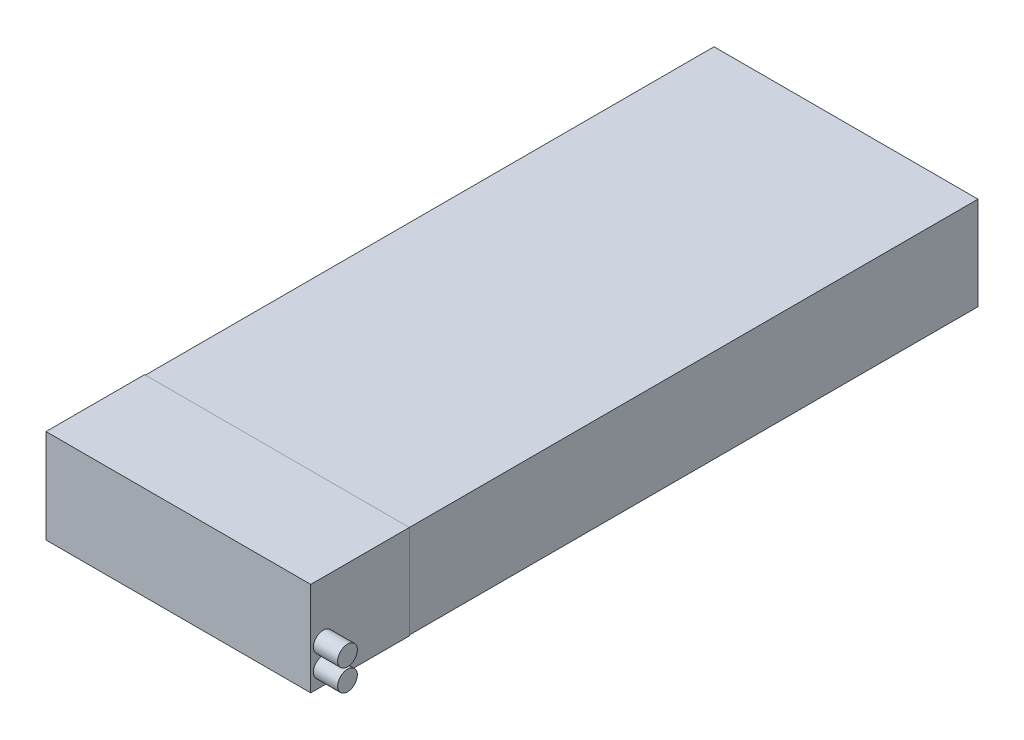
ISO-10303-21;
HEADER;
FILE_DESCRIPTION(('STEP AP214'),'2;1');
FILE_NAME('part.step','',(''),(''),'','','');
FILE_SCHEMA(('AUTOMOTIVE_DESIGN { 1 0 10303 214 1 1 1 1 }'));
ENDSEC;
DATA;
#1=APPLICATION_CONTEXT('core data for automotive mechanical design processes');
#2=APPLICATION_PROTOCOL_DEFINITION('international standard','automotive_design',2000,#1);
#3=PRODUCT_CONTEXT('',#1,'mechanical');
#4=PRODUCT('Part','Part','',(#3));
#5=PRODUCT_RELATED_PRODUCT_CATEGORY('part','',(#4));
#6=PRODUCT_DEFINITION_FORMATION('','',#4);
#7=PRODUCT_DEFINITION_CONTEXT('part definition',#1,'design');
#8=PRODUCT_DEFINITION('design','',#6,#7);
#9=PRODUCT_DEFINITION_SHAPE('','',#8);
#10=(LENGTH_UNIT() NAMED_UNIT(*) SI_UNIT(.MILLI.,.METRE.));
#11=(NAMED_UNIT(*) PLANE_ANGLE_UNIT() SI_UNIT($,.RADIAN.));
#12=(NAMED_UNIT(*) SI_UNIT($,.STERADIAN.) SOLID_ANGLE_UNIT());
#13=UNCERTAINTY_MEASURE_WITH_UNIT(LENGTH_MEASURE(1.E-05),#10,'distance_accuracy_value','');
#14=(GEOMETRIC_REPRESENTATION_CONTEXT(3) GLOBAL_UNCERTAINTY_ASSIGNED_CONTEXT((#13)) GLOBAL_UNIT_ASSIGNED_CONTEXT((#10,
#11,#12)) REPRESENTATION_CONTEXT('',''));
#15=CARTESIAN_POINT('',(0.,0.,0.));
#16=DIRECTION('',(0.,0.,1.));
#17=DIRECTION('',(1.,0.,0.));
#18=AXIS2_PLACEMENT_3D('',#15,#16,#17);
#19=CARTESIAN_POINT('',(17.0254,6.0254,36.65));
#20=DIRECTION('',(1.,0.,0.));
#21=DIRECTION('',(0.,1.,0.));
#22=AXIS2_PLACEMENT_3D('',#19,#20,#21);
#23=PLANE('',#22);
#24=CARTESIAN_POINT('',(17.0254,2.43816023383835,42.193767818982));
#25=DIRECTION('',(1.,0.,0.));
#26=DIRECTION('',(0.,1.,0.));
#27=AXIS2_PLACEMENT_3D('',#24,#25,#26);
#28=CIRCLE('',#27,0.634999999999995);
#29=CARTESIAN_POINT('',(17.0254,3.07316023383834,42.193767818982));
#30=VERTEX_POINT('',#29);
#31=EDGE_CURVE('E144',#30,#30,#28,.F.);
#32=ORIENTED_EDGE('',*,*,#31,.T.);
#33=EDGE_LOOP('',(#32));
#34=FACE_BOUND('',#33,.T.);
#35=DIRECTION('',(0.,1.,0.));
#36=VECTOR('',#35,1.);
#37=CARTESIAN_POINT('',(17.0254,6.0254,43.));
#38=LINE('',#37,#36);
#39=CARTESIAN_POINT('',(17.0254,-0.0254,43.));
#40=VERTEX_POINT('',#39);
#41=CARTESIAN_POINT('',(17.0254,6.0254,43.));
#42=VERTEX_POINT('',#41);
#43=EDGE_CURVE('E134',#40,#42,#38,.T.);
#44=ORIENTED_EDGE('',*,*,#43,.F.);
#45=DIRECTION('',(0.,0.,1.));
#46=VECTOR('',#45,1.);
#47=CARTESIAN_POINT('',(17.0254,-0.0254,36.65));
#48=LINE('',#47,#46);
#49=CARTESIAN_POINT('',(17.0254,-0.0254,36.65));
#50=VERTEX_POINT('',#49);
#51=EDGE_CURVE('E115',#50,#40,#48,.T.);
#52=ORIENTED_EDGE('',*,*,#51,.F.);
#53=DIRECTION('',(0.,1.,0.));
#54=VECTOR('',#53,1.);
#55=CARTESIAN_POINT('',(17.0254,6.0254,36.65));
#56=LINE('',#55,#54);
#57=CARTESIAN_POINT('',(17.0254,6.0254,36.65));
#58=VERTEX_POINT('',#57);
#59=EDGE_CURVE('E127',#50,#58,#56,.T.);
#60=ORIENTED_EDGE('',*,*,#59,.T.);
#61=DIRECTION('',(0.,0.,1.));
#62=VECTOR('',#61,1.);
#63=CARTESIAN_POINT('',(17.0254,6.0254,36.65));
#64=LINE('',#63,#62);
#65=EDGE_CURVE('E149',#58,#42,#64,.T.);
#66=ORIENTED_EDGE('',*,*,#65,.T.);
#67=EDGE_LOOP('',(#44,#52,#60,#66));
#68=FACE_BOUND('',#67,.T.);
#69=CARTESIAN_POINT('',(17.0254,1.04116023383835,42.193767818982));
#70=DIRECTION('',(1.,0.,0.));
#71=DIRECTION('',(0.,1.,0.));
#72=AXIS2_PLACEMENT_3D('',#69,#70,#71);
#73=CIRCLE('',#72,0.634999999999995);
#74=CARTESIAN_POINT('',(17.0254,1.67616023383834,42.193767818982));
#75=VERTEX_POINT('',#74);
#76=EDGE_CURVE('E41',#75,#75,#73,.F.);
#77=ORIENTED_EDGE('',*,*,#76,.T.);
#78=EDGE_LOOP('',(#77));
#79=FACE_BOUND('',#78,.T.);
#80=ADVANCED_FACE('F37',(#34,#68,#79),#23,.T.);
#81=CARTESIAN_POINT('',(0.,0.,43.));
#82=DIRECTION('',(1.,0.,0.));
#83=DIRECTION('',(0.,0.,-1.));
#84=AXIS2_PLACEMENT_3D('',#81,#82,#83);
#85=PLANE('',#84);
#86=DIRECTION('',(0.,-1.,0.));
#87=VECTOR('',#86,1.);
#88=CARTESIAN_POINT('',(0.,0.,36.65));
#89=LINE('',#88,#87);
#90=CARTESIAN_POINT('',(0.,6.,36.65));
#91=VERTEX_POINT('',#90);
#92=CARTESIAN_POINT('',(0.,0.,36.65));
#93=VERTEX_POINT('',#92);
#94=EDGE_CURVE('E154',#91,#93,#89,.T.);
#95=ORIENTED_EDGE('',*,*,#94,.F.);
#96=DIRECTION('',(0.,0.,-1.));
#97=VECTOR('',#96,1.);
#98=CARTESIAN_POINT('',(0.,6.,43.));
#99=LINE('',#98,#97);
#100=CARTESIAN_POINT('',(0.,6.,0.));
#101=VERTEX_POINT('',#100);
#102=EDGE_CURVE('E169',#91,#101,#99,.T.);
#103=ORIENTED_EDGE('',*,*,#102,.T.);
#104=DIRECTION('',(0.,-1.,0.));
#105=VECTOR('',#104,1.);
#106=CARTESIAN_POINT('',(0.,0.,0.));
#107=LINE('',#106,#105);
#108=CARTESIAN_POINT('',(0.,0.,0.));
#109=VERTEX_POINT('',#108);
#110=EDGE_CURVE('E157',#101,#109,#107,.T.);
#111=ORIENTED_EDGE('',*,*,#110,.T.);
#112=DIRECTION('',(0.,0.,-1.));
#113=VECTOR('',#112,1.);
#114=CARTESIAN_POINT('',(0.,0.,43.));
#115=LINE('',#114,#113);
#116=EDGE_CURVE('E46',#93,#109,#115,.T.);
#117=ORIENTED_EDGE('',*,*,#116,.F.);
#118=EDGE_LOOP('',(#95,#103,#111,#117));
#119=FACE_BOUND('',#118,.T.);
#120=ADVANCED_FACE('F39',(#119),#85,.F.);
#121=CARTESIAN_POINT('',(0.,0.,43.));
#122=DIRECTION('',(0.,1.,0.));
#123=DIRECTION('',(0.,0.,1.));
#124=AXIS2_PLACEMENT_3D('',#121,#122,#123);
#125=PLANE('',#124);
#126=DIRECTION('',(1.,0.,0.));
#127=VECTOR('',#126,1.);
#128=CARTESIAN_POINT('',(0.,0.,36.65));
#129=LINE('',#128,#127);
#130=CARTESIAN_POINT('',(17.,0.,36.65));
#131=VERTEX_POINT('',#130);
#132=EDGE_CURVE('E54',#93,#131,#129,.T.);
#133=ORIENTED_EDGE('',*,*,#132,.F.);
#134=ORIENTED_EDGE('',*,*,#116,.T.);
#135=DIRECTION('',(1.,0.,0.));
#136=VECTOR('',#135,1.);
#137=CARTESIAN_POINT('',(0.,0.,0.));
#138=LINE('',#137,#136);
#139=CARTESIAN_POINT('',(17.,0.,0.));
#140=VERTEX_POINT('',#139);
#141=EDGE_CURVE('E160',#109,#140,#138,.T.);
#142=ORIENTED_EDGE('',*,*,#141,.T.);
#143=DIRECTION('',(0.,0.,-1.));
#144=VECTOR('',#143,1.);
#145=CARTESIAN_POINT('',(17.,0.,43.));
#146=LINE('',#145,#144);
#147=EDGE_CURVE('E173',#131,#140,#146,.T.);
#148=ORIENTED_EDGE('',*,*,#147,.F.);
#149=EDGE_LOOP('',(#133,#134,#142,#148));
#150=FACE_BOUND('',#149,.T.);
#151=ADVANCED_FACE('F207',(#150),#125,.F.);
#152=CARTESIAN_POINT('',(17.,0.,43.));
#153=DIRECTION('',(-1.,0.,0.));
#154=DIRECTION('',(0.,0.,1.));
#155=AXIS2_PLACEMENT_3D('',#152,#153,#154);
#156=PLANE('',#155);
#157=DIRECTION('',(0.,1.,0.));
#158=VECTOR('',#157,1.);
#159=CARTESIAN_POINT('',(17.,0.,36.65));
#160=LINE('',#159,#158);
#161=CARTESIAN_POINT('',(17.,6.,36.65));
#162=VERTEX_POINT('',#161);
#163=EDGE_CURVE('E62',#131,#162,#160,.T.);
#164=ORIENTED_EDGE('',*,*,#163,.F.);
#165=ORIENTED_EDGE('',*,*,#147,.T.);
#166=DIRECTION('',(0.,1.,0.));
#167=VECTOR('',#166,1.);
#168=CARTESIAN_POINT('',(17.,0.,0.));
#169=LINE('',#168,#167);
#170=CARTESIAN_POINT('',(17.,6.,0.));
#171=VERTEX_POINT('',#170);
#172=EDGE_CURVE('E163',#140,#171,#169,.T.);
#173=ORIENTED_EDGE('',*,*,#172,.T.);
#174=DIRECTION('',(0.,0.,-1.));
#175=VECTOR('',#174,1.);
#176=CARTESIAN_POINT('',(17.,6.,43.));
#177=LINE('',#176,#175);
#178=EDGE_CURVE('E171',#162,#171,#177,.T.);
#179=ORIENTED_EDGE('',*,*,#178,.F.);
#180=EDGE_LOOP('',(#164,#165,#173,#179));
#181=FACE_BOUND('',#180,.T.);
#182=ADVANCED_FACE('F229',(#181),#156,.F.);
#183=CARTESIAN_POINT('',(0.,6.,43.));
#184=DIRECTION('',(0.,-1.,0.));
#185=DIRECTION('',(0.,0.,-1.));
#186=AXIS2_PLACEMENT_3D('',#183,#184,#185);
#187=PLANE('',#186);
#188=DIRECTION('',(-1.,0.,0.));
#189=VECTOR('',#188,1.);
#190=CARTESIAN_POINT('',(0.,6.,36.65));
#191=LINE('',#190,#189);
#192=EDGE_CURVE('E11',#162,#91,#191,.T.);
#193=ORIENTED_EDGE('',*,*,#192,.F.);
#194=ORIENTED_EDGE('',*,*,#178,.T.);
#195=DIRECTION('',(-1.,0.,0.));
#196=VECTOR('',#195,1.);
#197=CARTESIAN_POINT('',(0.,6.,0.));
#198=LINE('',#197,#196);
#199=EDGE_CURVE('E166',#171,#101,#198,.T.);
#200=ORIENTED_EDGE('',*,*,#199,.T.);
#201=ORIENTED_EDGE('',*,*,#102,.F.);
#202=EDGE_LOOP('',(#193,#194,#200,#201));
#203=FACE_BOUND('',#202,.T.);
#204=ADVANCED_FACE('F225',(#203),#187,.F.);
#205=CARTESIAN_POINT('',(0.,0.,0.));
#206=DIRECTION('',(0.,0.,-1.));
#207=DIRECTION('',(-1.,0.,0.));
#208=AXIS2_PLACEMENT_3D('',#205,#206,#207);
#209=PLANE('',#208);
#210=ORIENTED_EDGE('',*,*,#110,.F.);
#211=ORIENTED_EDGE('',*,*,#199,.F.);
#212=ORIENTED_EDGE('',*,*,#172,.F.);
#213=ORIENTED_EDGE('',*,*,#141,.F.);
#214=EDGE_LOOP('',(#210,#211,#212,#213));
#215=FACE_BOUND('',#214,.T.);
#216=ADVANCED_FACE('F222',(#215),#209,.T.);
#217=CARTESIAN_POINT('',(0.,0.,36.65));
#218=DIRECTION('',(0.,0.,1.));
#219=DIRECTION('',(1.,0.,0.));
#220=AXIS2_PLACEMENT_3D('',#217,#218,#219);
#221=PLANE('',#220);
#222=DIRECTION('',(0.,-1.,0.));
#223=VECTOR('',#222,1.);
#224=CARTESIAN_POINT('',(-0.0253999999999999,6.0254,36.65));
#225=LINE('',#224,#223);
#226=CARTESIAN_POINT('',(-0.0253999999999999,6.0254,36.65));
#227=VERTEX_POINT('',#226);
#228=CARTESIAN_POINT('',(-0.0253999999999993,-0.0254,36.65));
#229=VERTEX_POINT('',#228);
#230=EDGE_CURVE('E124',#227,#229,#225,.T.);
#231=ORIENTED_EDGE('',*,*,#230,.F.);
#232=DIRECTION('',(-1.,0.,0.));
#233=VECTOR('',#232,1.);
#234=CARTESIAN_POINT('',(-0.0253999999999999,6.0254,36.65));
#235=LINE('',#234,#233);
#236=EDGE_CURVE('E116',#58,#227,#235,.T.);
#237=ORIENTED_EDGE('',*,*,#236,.F.);
#238=ORIENTED_EDGE('',*,*,#59,.F.);
#239=DIRECTION('',(1.,0.,0.));
#240=VECTOR('',#239,1.);
#241=CARTESIAN_POINT('',(-0.0253999999999993,-0.0254,36.65));
#242=LINE('',#241,#240);
#243=EDGE_CURVE('E108',#229,#50,#242,.T.);
#244=ORIENTED_EDGE('',*,*,#243,.F.);
#245=EDGE_LOOP('',(#231,#237,#238,#244));
#246=FACE_BOUND('',#245,.T.);
#247=ORIENTED_EDGE('',*,*,#192,.T.);
#248=ORIENTED_EDGE('',*,*,#94,.T.);
#249=ORIENTED_EDGE('',*,*,#132,.T.);
#250=ORIENTED_EDGE('',*,*,#163,.T.);
#251=EDGE_LOOP('',(#247,#248,#249,#250));
#252=FACE_BOUND('',#251,.T.);
#253=ADVANCED_FACE('F121',(#246,#252),#221,.F.);
#254=CARTESIAN_POINT('',(-0.0253999999999999,6.0254,36.65));
#255=DIRECTION('',(-1.,0.,0.));
#256=DIRECTION('',(0.,-1.,0.));
#257=AXIS2_PLACEMENT_3D('',#254,#255,#256);
#258=PLANE('',#257);
#259=DIRECTION('',(0.,-1.,0.));
#260=VECTOR('',#259,1.);
#261=CARTESIAN_POINT('',(-0.0253999999999999,6.0254,43.));
#262=LINE('',#261,#260);
#263=CARTESIAN_POINT('',(-0.0253999999999999,6.0254,43.));
#264=VERTEX_POINT('',#263);
#265=CARTESIAN_POINT('',(-0.0253999999999993,-0.0254,43.));
#266=VERTEX_POINT('',#265);
#267=EDGE_CURVE('E142',#264,#266,#262,.T.);
#268=ORIENTED_EDGE('',*,*,#267,.F.);
#269=DIRECTION('',(0.,0.,1.));
#270=VECTOR('',#269,1.);
#271=CARTESIAN_POINT('',(-0.0253999999999999,6.0254,36.65));
#272=LINE('',#271,#270);
#273=EDGE_CURVE('E130',#227,#264,#272,.T.);
#274=ORIENTED_EDGE('',*,*,#273,.F.);
#275=ORIENTED_EDGE('',*,*,#230,.T.);
#276=DIRECTION('',(0.,0.,1.));
#277=VECTOR('',#276,1.);
#278=CARTESIAN_POINT('',(-0.0253999999999993,-0.0254,36.65));
#279=LINE('',#278,#277);
#280=EDGE_CURVE('E105',#229,#266,#279,.T.);
#281=ORIENTED_EDGE('',*,*,#280,.T.);
#282=EDGE_LOOP('',(#268,#274,#275,#281));
#283=FACE_BOUND('',#282,.T.);
#284=ADVANCED_FACE('F129',(#283),#258,.T.);
#285=CARTESIAN_POINT('',(-0.0253999999999999,6.0254,36.65));
#286=DIRECTION('',(0.,1.,0.));
#287=DIRECTION('',(0.,0.,1.));
#288=AXIS2_PLACEMENT_3D('',#285,#286,#287);
#289=PLANE('',#288);
#290=DIRECTION('',(-1.,0.,0.));
#291=VECTOR('',#290,1.);
#292=CARTESIAN_POINT('',(-0.0253999999999999,6.0254,43.));
#293=LINE('',#292,#291);
#294=EDGE_CURVE('E131',#42,#264,#293,.T.);
#295=ORIENTED_EDGE('',*,*,#294,.F.);
#296=ORIENTED_EDGE('',*,*,#65,.F.);
#297=ORIENTED_EDGE('',*,*,#236,.T.);
#298=ORIENTED_EDGE('',*,*,#273,.T.);
#299=EDGE_LOOP('',(#295,#296,#297,#298));
#300=FACE_BOUND('',#299,.T.);
#301=ADVANCED_FACE('F212',(#300),#289,.T.);
#302=CARTESIAN_POINT('',(-0.0253999999999993,-0.0254,36.65));
#303=DIRECTION('',(0.,-1.,0.));
#304=DIRECTION('',(0.,0.,-1.));
#305=AXIS2_PLACEMENT_3D('',#302,#303,#304);
#306=PLANE('',#305);
#307=DIRECTION('',(1.,0.,0.));
#308=VECTOR('',#307,1.);
#309=CARTESIAN_POINT('',(-0.0253999999999993,-0.0254,43.));
#310=LINE('',#309,#308);
#311=EDGE_CURVE('E110',#266,#40,#310,.T.);
#312=ORIENTED_EDGE('',*,*,#311,.F.);
#313=ORIENTED_EDGE('',*,*,#280,.F.);
#314=ORIENTED_EDGE('',*,*,#243,.T.);
#315=ORIENTED_EDGE('',*,*,#51,.T.);
#316=EDGE_LOOP('',(#312,#313,#314,#315));
#317=FACE_BOUND('',#316,.T.);
#318=ADVANCED_FACE('F107',(#317),#306,.T.);
#319=CARTESIAN_POINT('',(0.,0.,43.));
#320=DIRECTION('',(0.,0.,-1.));
#321=DIRECTION('',(-1.,0.,0.));
#322=AXIS2_PLACEMENT_3D('',#319,#320,#321);
#323=PLANE('',#322);
#324=ORIENTED_EDGE('',*,*,#267,.T.);
#325=ORIENTED_EDGE('',*,*,#311,.T.);
#326=ORIENTED_EDGE('',*,*,#43,.T.);
#327=ORIENTED_EDGE('',*,*,#294,.T.);
#328=EDGE_LOOP('',(#324,#325,#326,#327));
#329=FACE_BOUND('',#328,.T.);
#330=ADVANCED_FACE('F216',(#329),#323,.F.);
#331=CARTESIAN_POINT('',(18.5875,2.43816023383835,42.193767818982));
#332=DIRECTION('',(-1.,0.,0.));
#333=DIRECTION('',(0.,0.,1.));
#334=AXIS2_PLACEMENT_3D('',#331,#332,#333);
#335=CYLINDRICAL_SURFACE('',#334,0.634999999999995);
#336=ORIENTED_EDGE('',*,*,#31,.F.);
#337=EDGE_LOOP('',(#336));
#338=FACE_BOUND('',#337,.T.);
#339=CARTESIAN_POINT('',(18.5875,2.43816023383835,42.193767818982));
#340=DIRECTION('',(1.,0.,0.));
#341=DIRECTION('',(0.,0.,-1.));
#342=AXIS2_PLACEMENT_3D('',#339,#340,#341);
#343=CIRCLE('',#342,0.634999999999995);
#344=CARTESIAN_POINT('',(18.5875,2.43816023383835,41.558767818982));
#345=VERTEX_POINT('',#344);
#346=EDGE_CURVE('E137',#345,#345,#343,.T.);
#347=ORIENTED_EDGE('',*,*,#346,.F.);
#348=EDGE_LOOP('',(#347));
#349=FACE_BOUND('',#348,.T.);
#350=ADVANCED_FACE('F200',(#338,#349),#335,.T.);
#351=CARTESIAN_POINT('',(18.5875,0.,0.));
#352=DIRECTION('',(1.,0.,0.));
#353=DIRECTION('',(0.,0.,-1.));
#354=AXIS2_PLACEMENT_3D('',#351,#352,#353);
#355=PLANE('',#354);
#356=ORIENTED_EDGE('',*,*,#346,.T.);
#357=EDGE_LOOP('',(#356));
#358=FACE_BOUND('',#357,.T.);
#359=ADVANCED_FACE('F192',(#358),#355,.T.);
#360=CARTESIAN_POINT('',(18.5875,1.04116023383835,42.193767818982));
#361=DIRECTION('',(-1.,0.,0.));
#362=DIRECTION('',(0.,0.,1.));
#363=AXIS2_PLACEMENT_3D('',#360,#361,#362);
#364=CYLINDRICAL_SURFACE('',#363,0.634999999999995);
#365=ORIENTED_EDGE('',*,*,#76,.F.);
#366=EDGE_LOOP('',(#365));
#367=FACE_BOUND('',#366,.T.);
#368=CARTESIAN_POINT('',(18.5875,1.04116023383835,42.193767818982));
#369=DIRECTION('',(1.,0.,0.));
#370=DIRECTION('',(0.,0.,-1.));
#371=AXIS2_PLACEMENT_3D('',#368,#369,#370);
#372=CIRCLE('',#371,0.634999999999995);
#373=CARTESIAN_POINT('',(18.5875,1.04116023383835,41.558767818982));
#374=VERTEX_POINT('',#373);
#375=EDGE_CURVE('E182',#374,#374,#372,.T.);
#376=ORIENTED_EDGE('',*,*,#375,.F.);
#377=EDGE_LOOP('',(#376));
#378=FACE_BOUND('',#377,.T.);
#379=ADVANCED_FACE('F190',(#367,#378),#364,.T.);
#380=CARTESIAN_POINT('',(18.5875,0.,0.));
#381=DIRECTION('',(1.,0.,0.));
#382=DIRECTION('',(0.,0.,-1.));
#383=AXIS2_PLACEMENT_3D('',#380,#381,#382);
#384=PLANE('',#383);
#385=ORIENTED_EDGE('',*,*,#375,.T.);
#386=EDGE_LOOP('',(#385));
#387=FACE_BOUND('',#386,.T.);
#388=ADVANCED_FACE('F188',(#387),#384,.T.);
#389=CLOSED_SHELL('',(#80,#120,#151,#182,#204,#216,#253,#284,#301,#318,#330,#350,#359,#379,#388));
#390=MANIFOLD_SOLID_BREP('B2',#389);
#391=ADVANCED_BREP_SHAPE_REPRESENTATION('',(#18,#390),#14);
#392=SHAPE_DEFINITION_REPRESENTATION(#9,#391);
ENDSEC;
END-ISO-10303-21;
